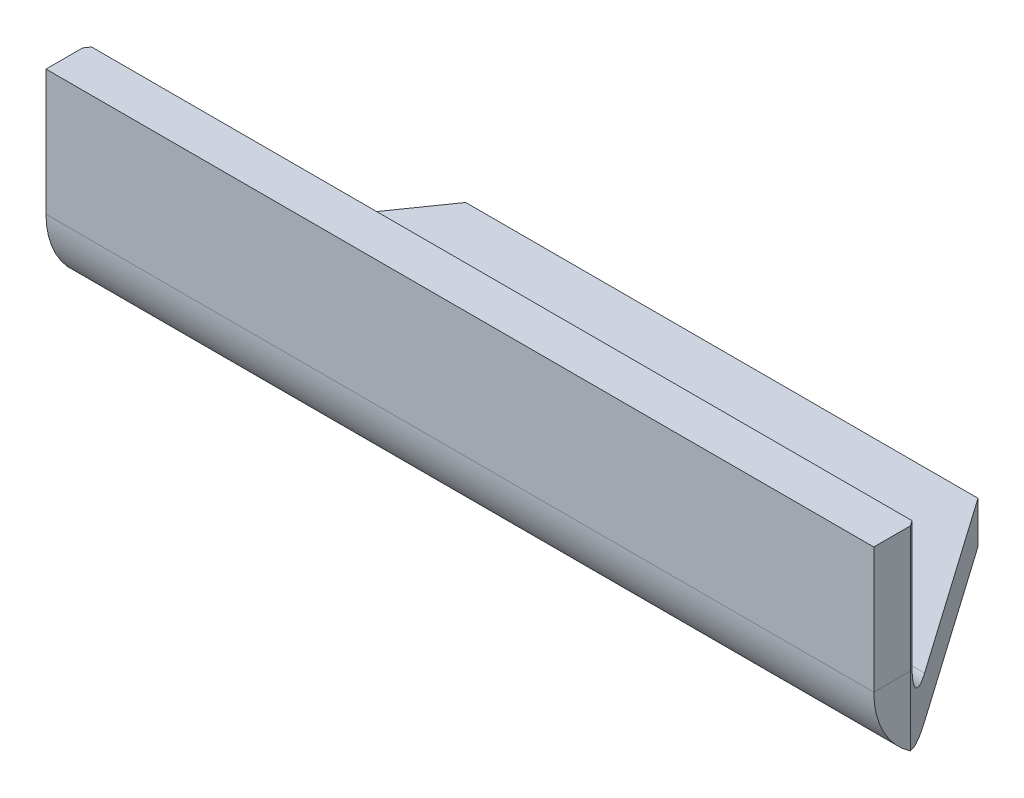
ISO-10303-21;
HEADER;
FILE_DESCRIPTION(('STEP AP214'),'2;1');
FILE_NAME('part.step','',(''),(''),'','','');
FILE_SCHEMA(('AUTOMOTIVE_DESIGN { 1 0 10303 214 1 1 1 1 }'));
ENDSEC;
DATA;
#1=APPLICATION_CONTEXT('core data for automotive mechanical design processes');
#2=APPLICATION_PROTOCOL_DEFINITION('international standard','automotive_design',2000,#1);
#3=PRODUCT_CONTEXT('',#1,'mechanical');
#4=PRODUCT('Part','Part','',(#3));
#5=PRODUCT_RELATED_PRODUCT_CATEGORY('part','',(#4));
#6=PRODUCT_DEFINITION_FORMATION('','',#4);
#7=PRODUCT_DEFINITION_CONTEXT('part definition',#1,'design');
#8=PRODUCT_DEFINITION('design','',#6,#7);
#9=PRODUCT_DEFINITION_SHAPE('','',#8);
#10=(LENGTH_UNIT() NAMED_UNIT(*) SI_UNIT(.MILLI.,.METRE.));
#11=(NAMED_UNIT(*) PLANE_ANGLE_UNIT() SI_UNIT($,.RADIAN.));
#12=(NAMED_UNIT(*) SI_UNIT($,.STERADIAN.) SOLID_ANGLE_UNIT());
#13=UNCERTAINTY_MEASURE_WITH_UNIT(LENGTH_MEASURE(1.E-05),#10,'distance_accuracy_value','');
#14=(GEOMETRIC_REPRESENTATION_CONTEXT(3) GLOBAL_UNCERTAINTY_ASSIGNED_CONTEXT((#13)) GLOBAL_UNIT_ASSIGNED_CONTEXT((#10,
#11,#12)) REPRESENTATION_CONTEXT('',''));
#15=CARTESIAN_POINT('',(0.,0.,0.));
#16=DIRECTION('',(0.,0.,1.));
#17=DIRECTION('',(1.,0.,0.));
#18=AXIS2_PLACEMENT_3D('',#15,#16,#17);
#19=CARTESIAN_POINT('',(0.,-8.,0.));
#20=DIRECTION('',(0.,-1.,0.));
#21=DIRECTION('',(0.,0.,-1.));
#22=AXIS2_PLACEMENT_3D('',#19,#20,#21);
#23=PLANE('',#22);
#24=DIRECTION('',(-1.,0.,0.));
#25=VECTOR('',#24,1.);
#26=CARTESIAN_POINT('',(-79.,-8.,-25.));
#27=LINE('',#26,#25);
#28=CARTESIAN_POINT('',(48.891075856982,-8.,-25.));
#29=VERTEX_POINT('',#28);
#30=CARTESIAN_POINT('',(-48.891075856982,-8.,-25.));
#31=VERTEX_POINT('',#30);
#32=EDGE_CURVE('E168',#29,#31,#27,.T.);
#33=ORIENTED_EDGE('',*,*,#32,.F.);
#34=DIRECTION('',(0.573576436351051,0.,0.819152044288988));
#35=VECTOR('',#34,1.);
#36=CARTESIAN_POINT('',(44.5525620742902,-8.,-31.1960398109744));
#37=LINE('',#36,#35);
#38=CARTESIAN_POINT('',(72.6981321561125,-8.00000000000003,9.00000000000003));
#39=VERTEX_POINT('',#38);
#40=EDGE_CURVE('E196',#39,#29,#37,.F.);
#41=ORIENTED_EDGE('',*,*,#40,.F.);
#42=DIRECTION('',(1.,0.,0.));
#43=VECTOR('',#42,1.);
#44=CARTESIAN_POINT('',(79.,-8.00000000000003,9.00000000000003));
#45=LINE('',#44,#43);
#46=CARTESIAN_POINT('',(-72.6981321561125,-8.00000000000003,9.00000000000003));
#47=VERTEX_POINT('',#46);
#48=EDGE_CURVE('E81',#39,#47,#45,.F.);
#49=ORIENTED_EDGE('',*,*,#48,.T.);
#50=DIRECTION('',(-0.573576436351051,0.,0.819152044288988));
#51=VECTOR('',#50,1.);
#52=CARTESIAN_POINT('',(-44.5525620742902,-8.,-31.1960398109744));
#53=LINE('',#52,#51);
#54=EDGE_CURVE('E13',#47,#31,#53,.F.);
#55=ORIENTED_EDGE('',*,*,#54,.T.);
#56=EDGE_LOOP('',(#33,#41,#49,#55));
#57=FACE_BOUND('',#56,.T.);
#58=ADVANCED_FACE('F58',(#57),#23,.T.);
#59=CARTESIAN_POINT('',(0.,0.,0.));
#60=DIRECTION('',(0.,-1.,0.));
#61=DIRECTION('',(0.,0.,-1.));
#62=AXIS2_PLACEMENT_3D('',#59,#60,#61);
#63=PLANE('',#62);
#64=DIRECTION('',(-0.573576436351051,0.,-0.819152044288988));
#65=VECTOR('',#64,1.);
#66=CARTESIAN_POINT('',(48.891075856982,0.,-25.));
#67=LINE('',#66,#65);
#68=CARTESIAN_POINT('',(48.891075856982,0.,-25.));
#69=VERTEX_POINT('',#68);
#70=CARTESIAN_POINT('',(72.6981321561125,0.,9.00000000000002));
#71=VERTEX_POINT('',#70);
#72=EDGE_CURVE('E203',#69,#71,#67,.F.);
#73=ORIENTED_EDGE('',*,*,#72,.F.);
#74=DIRECTION('',(-1.,0.,0.));
#75=VECTOR('',#74,1.);
#76=CARTESIAN_POINT('',(-79.,0.,-25.));
#77=LINE('',#76,#75);
#78=CARTESIAN_POINT('',(-48.891075856982,0.,-25.));
#79=VERTEX_POINT('',#78);
#80=EDGE_CURVE('E171',#69,#79,#77,.T.);
#81=ORIENTED_EDGE('',*,*,#80,.T.);
#82=DIRECTION('',(0.573576436351051,0.,-0.819152044288988));
#83=VECTOR('',#82,1.);
#84=CARTESIAN_POINT('',(-48.891075856982,0.,-25.));
#85=LINE('',#84,#83);
#86=CARTESIAN_POINT('',(-72.6981321561125,0.,9.00000000000002));
#87=VERTEX_POINT('',#86);
#88=EDGE_CURVE('E175',#79,#87,#85,.F.);
#89=ORIENTED_EDGE('',*,*,#88,.T.);
#90=DIRECTION('',(1.,0.,0.));
#91=VECTOR('',#90,1.);
#92=CARTESIAN_POINT('',(79.,0.,9.00000000000002));
#93=LINE('',#92,#91);
#94=EDGE_CURVE('E160',#71,#87,#93,.F.);
#95=ORIENTED_EDGE('',*,*,#94,.F.);
#96=EDGE_LOOP('',(#73,#81,#89,#95));
#97=FACE_BOUND('',#96,.T.);
#98=ADVANCED_FACE('F261',(#97),#63,.F.);
#99=CARTESIAN_POINT('',(-79.,-8.,-25.));
#100=DIRECTION('',(0.,0.,-1.));
#101=DIRECTION('',(-1.,0.,0.));
#102=AXIS2_PLACEMENT_3D('',#99,#100,#101);
#103=PLANE('',#102);
#104=ORIENTED_EDGE('',*,*,#80,.F.);
#105=DIRECTION('',(0.,1.,0.));
#106=VECTOR('',#105,1.);
#107=CARTESIAN_POINT('',(48.891075856982,-8.,-25.));
#108=LINE('',#107,#106);
#109=EDGE_CURVE('E201',#29,#69,#108,.T.);
#110=ORIENTED_EDGE('',*,*,#109,.F.);
#111=ORIENTED_EDGE('',*,*,#32,.T.);
#112=DIRECTION('',(0.,1.,0.));
#113=VECTOR('',#112,1.);
#114=CARTESIAN_POINT('',(-48.891075856982,-8.,-25.));
#115=LINE('',#114,#113);
#116=EDGE_CURVE('E170',#31,#79,#115,.T.);
#117=ORIENTED_EDGE('',*,*,#116,.T.);
#118=EDGE_LOOP('',(#104,#110,#111,#117));
#119=FACE_BOUND('',#118,.T.);
#120=ADVANCED_FACE('F200',(#119),#103,.T.);
#121=CARTESIAN_POINT('',(79.,7.99999999999997,9.00000000000002));
#122=DIRECTION('',(-1.,0.,0.));
#123=DIRECTION('',(0.,0.,1.));
#124=AXIS2_PLACEMENT_3D('',#121,#122,#123);
#125=PLANE('',#124);
#126=CARTESIAN_POINT('',(79.,7.99999999999997,9.00000000000002));
#127=DIRECTION('',(1.,0.,0.));
#128=DIRECTION('',(0.,0.,-1.));
#129=AXIS2_PLACEMENT_3D('',#126,#127,#128);
#130=CIRCLE('',#129,16.);
#131=CARTESIAN_POINT('',(79.,7.99999999999997,25.));
#132=VERTEX_POINT('',#131);
#133=CARTESIAN_POINT('',(79.,-5.22875655532285,18.0000000000002));
#134=VERTEX_POINT('',#133);
#135=EDGE_CURVE('E155',#132,#134,#130,.T.);
#136=ORIENTED_EDGE('',*,*,#135,.T.);
#137=DIRECTION('',(0.,-1.,0.));
#138=VECTOR('',#137,1.);
#139=CARTESIAN_POINT('',(79.,7.99999999999997,18.0000000000002));
#140=LINE('',#139,#138);
#141=CARTESIAN_POINT('',(79.,7.99999999999997,18.0000000000002));
#142=VERTEX_POINT('',#141);
#143=EDGE_CURVE('E141',#142,#134,#140,.T.);
#144=ORIENTED_EDGE('',*,*,#143,.F.);
#145=DIRECTION('',(0.,0.,-1.));
#146=VECTOR('',#145,1.);
#147=CARTESIAN_POINT('',(79.,7.99999999999997,17.));
#148=LINE('',#147,#146);
#149=EDGE_CURVE('E159',#142,#132,#148,.F.);
#150=ORIENTED_EDGE('',*,*,#149,.T.);
#151=EDGE_LOOP('',(#136,#144,#150));
#152=FACE_BOUND('',#151,.T.);
#153=ADVANCED_FACE('F158',(#152),#125,.F.);
#154=CARTESIAN_POINT('',(79.,7.99999999999997,9.00000000000002));
#155=DIRECTION('',(1.,0.,0.));
#156=DIRECTION('',(0.,0.,1.));
#157=AXIS2_PLACEMENT_3D('',#154,#155,#156);
#158=CYLINDRICAL_SURFACE('',#157,16.);
#159=ORIENTED_EDGE('',*,*,#48,.F.);
#160=CARTESIAN_POINT('',(72.6981321561125,7.99999999999997,9.00000000000002));
#161=DIRECTION('',(0.819152044288988,0.,-0.573576436351051));
#162=DIRECTION('',(-0.573576436351051,0.,-0.819152044288988));
#163=AXIS2_PLACEMENT_3D('',#160,#161,#162);
#164=ELLIPSE('',#163,19.5323934201834,16.);
#165=EDGE_CURVE('E144',#134,#39,#164,.T.);
#166=ORIENTED_EDGE('',*,*,#165,.F.);
#167=ORIENTED_EDGE('',*,*,#135,.F.);
#168=DIRECTION('',(1.,0.,0.));
#169=VECTOR('',#168,1.);
#170=CARTESIAN_POINT('',(-79.,7.99999999999997,25.));
#171=LINE('',#170,#169);
#172=CARTESIAN_POINT('',(-79.,7.99999999999997,25.));
#173=VERTEX_POINT('',#172);
#174=EDGE_CURVE('E225',#132,#173,#171,.F.);
#175=ORIENTED_EDGE('',*,*,#174,.T.);
#176=CARTESIAN_POINT('',(-79.,7.99999999999997,9.00000000000002));
#177=DIRECTION('',(1.,0.,0.));
#178=DIRECTION('',(0.,0.,-1.));
#179=AXIS2_PLACEMENT_3D('',#176,#177,#178);
#180=CIRCLE('',#179,16.);
#181=CARTESIAN_POINT('',(-79.,-5.22875655532285,18.0000000000002));
#182=VERTEX_POINT('',#181);
#183=EDGE_CURVE('E162',#182,#173,#180,.F.);
#184=ORIENTED_EDGE('',*,*,#183,.F.);
#185=CARTESIAN_POINT('',(-72.6981321561125,7.99999999999997,9.00000000000002));
#186=DIRECTION('',(0.819152044288988,0.,0.573576436351051));
#187=DIRECTION('',(0.573576436351051,0.,-0.819152044288988));
#188=AXIS2_PLACEMENT_3D('',#185,#186,#187);
#189=ELLIPSE('',#188,19.5323934201834,16.);
#190=EDGE_CURVE('E67',#182,#47,#189,.T.);
#191=ORIENTED_EDGE('',*,*,#190,.T.);
#192=EDGE_LOOP('',(#159,#166,#167,#175,#184,#191));
#193=FACE_BOUND('',#192,.T.);
#194=ADVANCED_FACE('F153',(#193),#158,.T.);
#195=CARTESIAN_POINT('',(79.,7.99999999999997,9.00000000000002));
#196=DIRECTION('',(1.,0.,0.));
#197=DIRECTION('',(0.,0.,1.));
#198=AXIS2_PLACEMENT_3D('',#195,#196,#197);
#199=CYLINDRICAL_SURFACE('',#198,8.);
#200=CARTESIAN_POINT('',(72.6981321561125,7.99999999999997,9.00000000000002));
#201=DIRECTION('',(0.819152044288988,0.,-0.573576436351051));
#202=DIRECTION('',(-0.573576436351051,0.,-0.819152044288988));
#203=AXIS2_PLACEMENT_3D('',#200,#201,#202);
#204=ELLIPSE('',#203,9.76619671009169,8.);
#205=CARTESIAN_POINT('',(78.2997924617902,7.99999999999997,17.));
#206=VERTEX_POINT('',#205);
#207=EDGE_CURVE('E207',#71,#206,#204,.F.);
#208=ORIENTED_EDGE('',*,*,#207,.F.);
#209=ORIENTED_EDGE('',*,*,#94,.T.);
#210=CARTESIAN_POINT('',(-72.6981321561125,7.99999999999997,9.00000000000002));
#211=DIRECTION('',(0.819152044288988,0.,0.573576436351051));
#212=DIRECTION('',(0.573576436351051,0.,-0.819152044288988));
#213=AXIS2_PLACEMENT_3D('',#210,#211,#212);
#214=ELLIPSE('',#213,9.76619671009169,8.);
#215=CARTESIAN_POINT('',(-78.2997924617902,7.99999999999997,17.));
#216=VERTEX_POINT('',#215);
#217=EDGE_CURVE('E178',#87,#216,#214,.F.);
#218=ORIENTED_EDGE('',*,*,#217,.T.);
#219=DIRECTION('',(1.,0.,0.));
#220=VECTOR('',#219,1.);
#221=CARTESIAN_POINT('',(-79.,7.99999999999997,17.));
#222=LINE('',#221,#220);
#223=EDGE_CURVE('E228',#216,#206,#222,.T.);
#224=ORIENTED_EDGE('',*,*,#223,.T.);
#225=EDGE_LOOP('',(#208,#209,#218,#224));
#226=FACE_BOUND('',#225,.T.);
#227=ADVANCED_FACE('F275',(#226),#199,.F.);
#228=CARTESIAN_POINT('',(79.,32.,25.));
#229=DIRECTION('',(-1.,0.,0.));
#230=DIRECTION('',(0.,-1.,0.));
#231=AXIS2_PLACEMENT_3D('',#228,#229,#230);
#232=PLANE('',#231);
#233=CARTESIAN_POINT('',(79.,32.,18.0000000000002));
#234=VERTEX_POINT('',#233);
#235=EDGE_CURVE('E146',#234,#142,#140,.T.);
#236=ORIENTED_EDGE('',*,*,#235,.F.);
#237=DIRECTION('',(0.,0.,-1.));
#238=VECTOR('',#237,1.);
#239=CARTESIAN_POINT('',(79.,32.,25.));
#240=LINE('',#239,#238);
#241=CARTESIAN_POINT('',(79.,32.,25.));
#242=VERTEX_POINT('',#241);
#243=EDGE_CURVE('E164',#242,#234,#240,.T.);
#244=ORIENTED_EDGE('',*,*,#243,.F.);
#245=DIRECTION('',(0.,1.,0.));
#246=VECTOR('',#245,1.);
#247=CARTESIAN_POINT('',(79.,-1.37043154602168E-13,25.));
#248=LINE('',#247,#246);
#249=EDGE_CURVE('E218',#132,#242,#248,.T.);
#250=ORIENTED_EDGE('',*,*,#249,.F.);
#251=ORIENTED_EDGE('',*,*,#149,.F.);
#252=EDGE_LOOP('',(#236,#244,#250,#251));
#253=FACE_BOUND('',#252,.T.);
#254=ADVANCED_FACE('F280',(#253),#232,.F.);
#255=CARTESIAN_POINT('',(0.,0.,17.));
#256=DIRECTION('',(0.,0.,-1.));
#257=DIRECTION('',(-1.,0.,0.));
#258=AXIS2_PLACEMENT_3D('',#255,#256,#257);
#259=PLANE('',#258);
#260=DIRECTION('',(1.,0.,0.));
#261=VECTOR('',#260,1.);
#262=CARTESIAN_POINT('',(-79.,32.,17.));
#263=LINE('',#262,#261);
#264=CARTESIAN_POINT('',(78.2997924617901,32.,17.));
#265=VERTEX_POINT('',#264);
#266=CARTESIAN_POINT('',(-78.2997924617902,32.,17.));
#267=VERTEX_POINT('',#266);
#268=EDGE_CURVE('E223',#265,#267,#263,.F.);
#269=ORIENTED_EDGE('',*,*,#268,.F.);
#270=DIRECTION('',(0.,-1.,0.));
#271=VECTOR('',#270,1.);
#272=CARTESIAN_POINT('',(78.2997924617902,0.,17.));
#273=LINE('',#272,#271);
#274=EDGE_CURVE('E74',#206,#265,#273,.F.);
#275=ORIENTED_EDGE('',*,*,#274,.F.);
#276=ORIENTED_EDGE('',*,*,#223,.F.);
#277=DIRECTION('',(0.,-1.,0.));
#278=VECTOR('',#277,1.);
#279=CARTESIAN_POINT('',(-78.2997924617902,0.,17.));
#280=LINE('',#279,#278);
#281=EDGE_CURVE('E180',#216,#267,#280,.F.);
#282=ORIENTED_EDGE('',*,*,#281,.T.);
#283=EDGE_LOOP('',(#269,#275,#276,#282));
#284=FACE_BOUND('',#283,.T.);
#285=ADVANCED_FACE('F256',(#284),#259,.T.);
#286=CARTESIAN_POINT('',(-79.,32.,25.));
#287=DIRECTION('',(0.,-1.,0.));
#288=DIRECTION('',(0.,0.,-1.));
#289=AXIS2_PLACEMENT_3D('',#286,#287,#288);
#290=PLANE('',#289);
#291=DIRECTION('',(-0.573576436351051,0.,-0.819152044288988));
#292=VECTOR('',#291,1.);
#293=CARTESIAN_POINT('',(48.891075856982,32.,-25.));
#294=LINE('',#293,#292);
#295=EDGE_CURVE('E393',#265,#234,#294,.F.);
#296=ORIENTED_EDGE('',*,*,#295,.F.);
#297=ORIENTED_EDGE('',*,*,#268,.T.);
#298=DIRECTION('',(0.573576436351051,0.,-0.819152044288988));
#299=VECTOR('',#298,1.);
#300=CARTESIAN_POINT('',(-48.891075856982,32.,-25.));
#301=LINE('',#300,#299);
#302=CARTESIAN_POINT('',(-79.,32.,18.0000000000002));
#303=VERTEX_POINT('',#302);
#304=EDGE_CURVE('E183',#267,#303,#301,.F.);
#305=ORIENTED_EDGE('',*,*,#304,.T.);
#306=DIRECTION('',(0.,0.,-1.));
#307=VECTOR('',#306,1.);
#308=CARTESIAN_POINT('',(-79.,32.,25.));
#309=LINE('',#308,#307);
#310=CARTESIAN_POINT('',(-79.,32.,25.));
#311=VERTEX_POINT('',#310);
#312=EDGE_CURVE('E213',#311,#303,#309,.T.);
#313=ORIENTED_EDGE('',*,*,#312,.F.);
#314=DIRECTION('',(-1.,0.,0.));
#315=VECTOR('',#314,1.);
#316=CARTESIAN_POINT('',(0.,32.,25.));
#317=LINE('',#316,#315);
#318=EDGE_CURVE('E216',#242,#311,#317,.T.);
#319=ORIENTED_EDGE('',*,*,#318,.F.);
#320=ORIENTED_EDGE('',*,*,#243,.T.);
#321=EDGE_LOOP('',(#296,#297,#305,#313,#319,#320));
#322=FACE_BOUND('',#321,.T.);
#323=ADVANCED_FACE('F245',(#322),#290,.F.);
#324=CARTESIAN_POINT('',(-79.,7.99999999999997,9.00000000000002));
#325=DIRECTION('',(-1.,0.,0.));
#326=DIRECTION('',(0.,0.,1.));
#327=AXIS2_PLACEMENT_3D('',#324,#325,#326);
#328=PLANE('',#327);
#329=DIRECTION('',(0.,0.,-1.));
#330=VECTOR('',#329,1.);
#331=CARTESIAN_POINT('',(-79.,7.99999999999997,25.));
#332=LINE('',#331,#330);
#333=CARTESIAN_POINT('',(-79.,7.99999999999997,18.0000000000002));
#334=VERTEX_POINT('',#333);
#335=EDGE_CURVE('E205',#334,#173,#332,.F.);
#336=ORIENTED_EDGE('',*,*,#335,.F.);
#337=DIRECTION('',(0.,-1.,0.));
#338=VECTOR('',#337,1.);
#339=CARTESIAN_POINT('',(-79.,7.99999999999997,18.0000000000002));
#340=LINE('',#339,#338);
#341=EDGE_CURVE('E187',#334,#182,#340,.T.);
#342=ORIENTED_EDGE('',*,*,#341,.T.);
#343=ORIENTED_EDGE('',*,*,#183,.T.);
#344=EDGE_LOOP('',(#336,#342,#343));
#345=FACE_BOUND('',#344,.T.);
#346=ADVANCED_FACE('F248',(#345),#328,.T.);
#347=CARTESIAN_POINT('',(-79.,0.,25.));
#348=DIRECTION('',(1.,0.,0.));
#349=DIRECTION('',(0.,1.,0.));
#350=AXIS2_PLACEMENT_3D('',#347,#348,#349);
#351=PLANE('',#350);
#352=ORIENTED_EDGE('',*,*,#312,.T.);
#353=DIRECTION('',(0.,1.,0.));
#354=VECTOR('',#353,1.);
#355=CARTESIAN_POINT('',(-79.0000000000001,-7.99999999999988,18.0000000000002));
#356=LINE('',#355,#354);
#357=EDGE_CURVE('E185',#303,#334,#356,.F.);
#358=ORIENTED_EDGE('',*,*,#357,.T.);
#359=ORIENTED_EDGE('',*,*,#335,.T.);
#360=DIRECTION('',(0.,-1.,0.));
#361=VECTOR('',#360,1.);
#362=CARTESIAN_POINT('',(-79.,1.02782365951626E-13,25.));
#363=LINE('',#362,#361);
#364=EDGE_CURVE('E220',#311,#173,#363,.T.);
#365=ORIENTED_EDGE('',*,*,#364,.F.);
#366=EDGE_LOOP('',(#352,#358,#359,#365));
#367=FACE_BOUND('',#366,.T.);
#368=ADVANCED_FACE('F235',(#367),#351,.F.);
#369=CARTESIAN_POINT('',(0.,0.,25.));
#370=DIRECTION('',(0.,0.,-1.));
#371=DIRECTION('',(-1.,0.,0.));
#372=AXIS2_PLACEMENT_3D('',#369,#370,#371);
#373=PLANE('',#372);
#374=ORIENTED_EDGE('',*,*,#174,.F.);
#375=ORIENTED_EDGE('',*,*,#249,.T.);
#376=ORIENTED_EDGE('',*,*,#318,.T.);
#377=ORIENTED_EDGE('',*,*,#364,.T.);
#378=EDGE_LOOP('',(#374,#375,#376,#377));
#379=FACE_BOUND('',#378,.T.);
#380=ADVANCED_FACE('F240',(#379),#373,.F.);
#381=CARTESIAN_POINT('',(-48.891075856982,-8.,-25.));
#382=DIRECTION('',(0.819152044288988,0.,0.573576436351051));
#383=DIRECTION('',(0.,1.,0.));
#384=AXIS2_PLACEMENT_3D('',#381,#382,#383);
#385=PLANE('',#384);
#386=ORIENTED_EDGE('',*,*,#190,.F.);
#387=ORIENTED_EDGE('',*,*,#341,.F.);
#388=ORIENTED_EDGE('',*,*,#357,.F.);
#389=ORIENTED_EDGE('',*,*,#304,.F.);
#390=ORIENTED_EDGE('',*,*,#281,.F.);
#391=ORIENTED_EDGE('',*,*,#217,.F.);
#392=ORIENTED_EDGE('',*,*,#88,.F.);
#393=ORIENTED_EDGE('',*,*,#116,.F.);
#394=ORIENTED_EDGE('',*,*,#54,.F.);
#395=EDGE_LOOP('',(#386,#387,#388,#389,#390,#391,#392,#393,#394));
#396=FACE_BOUND('',#395,.T.);
#397=ADVANCED_FACE('F61',(#396),#385,.F.);
#398=CARTESIAN_POINT('',(48.891075856982,-8.,-25.));
#399=DIRECTION('',(-0.819152044288988,0.,0.573576436351051));
#400=DIRECTION('',(0.,1.,0.));
#401=AXIS2_PLACEMENT_3D('',#398,#399,#400);
#402=PLANE('',#401);
#403=ORIENTED_EDGE('',*,*,#165,.T.);
#404=ORIENTED_EDGE('',*,*,#40,.T.);
#405=ORIENTED_EDGE('',*,*,#109,.T.);
#406=ORIENTED_EDGE('',*,*,#72,.T.);
#407=ORIENTED_EDGE('',*,*,#207,.T.);
#408=ORIENTED_EDGE('',*,*,#274,.T.);
#409=ORIENTED_EDGE('',*,*,#295,.T.);
#410=ORIENTED_EDGE('',*,*,#235,.T.);
#411=ORIENTED_EDGE('',*,*,#143,.T.);
#412=EDGE_LOOP('',(#403,#404,#405,#406,#407,#408,#409,#410,#411));
#413=FACE_BOUND('',#412,.T.);
#414=ADVANCED_FACE('F143',(#413),#402,.F.);
#415=CLOSED_SHELL('',(#58,#98,#120,#153,#194,#227,#254,#285,#323,#346,#368,#380,#397,#414));
#416=MANIFOLD_SOLID_BREP('B2',#415);
#417=ADVANCED_BREP_SHAPE_REPRESENTATION('',(#18,#416),#14);
#418=SHAPE_DEFINITION_REPRESENTATION(#9,#417);
ENDSEC;
END-ISO-10303-21;
